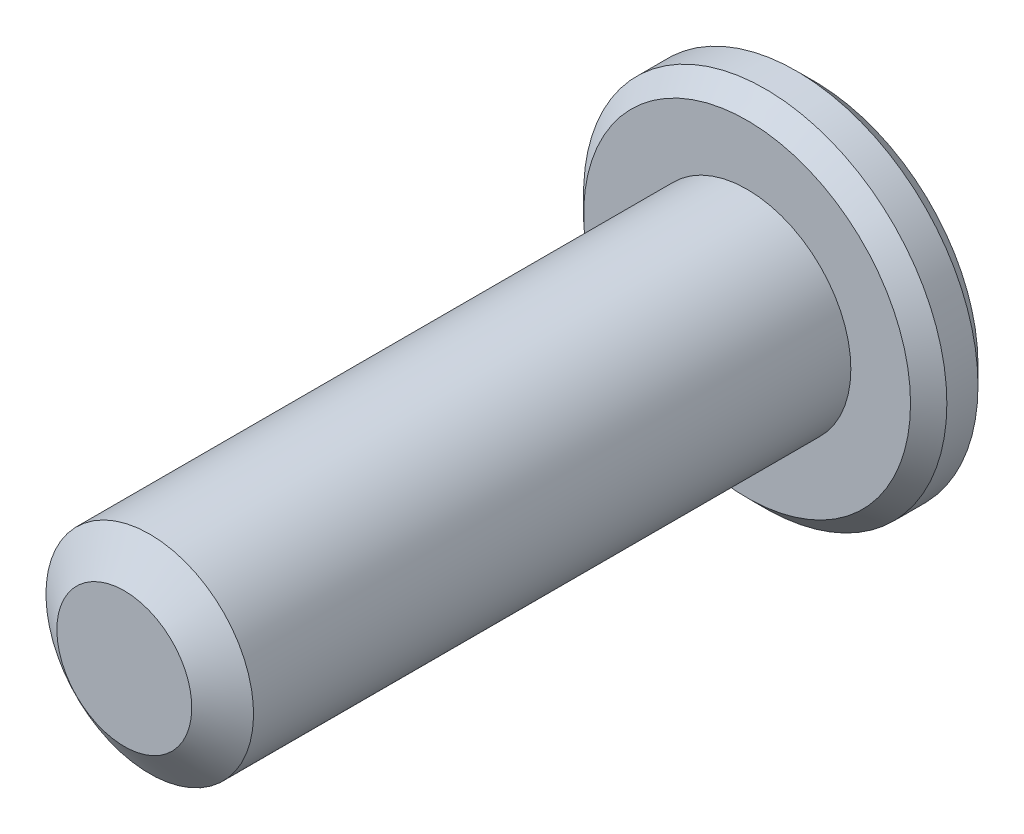
ISO-10303-21;
HEADER;
FILE_DESCRIPTION(('STEP AP214'),'2;1');
FILE_NAME('part.step','',(''),(''),'','','');
FILE_SCHEMA(('AUTOMOTIVE_DESIGN { 1 0 10303 214 1 1 1 1 }'));
ENDSEC;
DATA;
#1=APPLICATION_CONTEXT('core data for automotive mechanical design processes');
#2=APPLICATION_PROTOCOL_DEFINITION('international standard','automotive_design',2000,#1);
#3=PRODUCT_CONTEXT('',#1,'mechanical');
#4=PRODUCT('Part','Part','',(#3));
#5=PRODUCT_RELATED_PRODUCT_CATEGORY('part','',(#4));
#6=PRODUCT_DEFINITION_FORMATION('','',#4);
#7=PRODUCT_DEFINITION_CONTEXT('part definition',#1,'design');
#8=PRODUCT_DEFINITION('design','',#6,#7);
#9=PRODUCT_DEFINITION_SHAPE('','',#8);
#10=(LENGTH_UNIT() NAMED_UNIT(*) SI_UNIT(.MILLI.,.METRE.));
#11=(NAMED_UNIT(*) PLANE_ANGLE_UNIT() SI_UNIT($,.RADIAN.));
#12=(NAMED_UNIT(*) SI_UNIT($,.STERADIAN.) SOLID_ANGLE_UNIT());
#13=UNCERTAINTY_MEASURE_WITH_UNIT(LENGTH_MEASURE(1.E-05),#10,'distance_accuracy_value','');
#14=(GEOMETRIC_REPRESENTATION_CONTEXT(3) GLOBAL_UNCERTAINTY_ASSIGNED_CONTEXT((#13)) GLOBAL_UNIT_ASSIGNED_CONTEXT((#10,
#11,#12)) REPRESENTATION_CONTEXT('',''));
#15=CARTESIAN_POINT('',(0.,0.,0.));
#16=DIRECTION('',(0.,0.,1.));
#17=DIRECTION('',(1.,0.,0.));
#18=AXIS2_PLACEMENT_3D('',#15,#16,#17);
#19=CARTESIAN_POINT('',(0.,0.,0.));
#20=DIRECTION('',(0.,0.,1.));
#21=DIRECTION('',(1.,0.,0.));
#22=AXIS2_PLACEMENT_3D('',#19,#20,#21);
#23=PLANE('',#22);
#24=CARTESIAN_POINT('',(0.,0.,0.));
#25=DIRECTION('',(0.,0.,1.));
#26=DIRECTION('',(1.,0.,0.));
#27=AXIS2_PLACEMENT_3D('',#24,#25,#26);
#28=CIRCLE('',#27,3.15);
#29=CARTESIAN_POINT('',(3.15,0.,0.));
#30=VERTEX_POINT('',#29);
#31=EDGE_CURVE('E11',#30,#30,#28,.F.);
#32=ORIENTED_EDGE('',*,*,#31,.T.);
#33=EDGE_LOOP('',(#32));
#34=FACE_BOUND('',#33,.T.);
#35=CARTESIAN_POINT('',(0.,0.,0.));
#36=DIRECTION('',(0.,0.,1.));
#37=DIRECTION('',(1.,0.,0.));
#38=AXIS2_PLACEMENT_3D('',#35,#36,#37);
#39=CIRCLE('',#38,1.44337567297406);
#40=CARTESIAN_POINT('',(1.25,0.721687836487034,0.));
#41=VERTEX_POINT('',#40);
#42=CARTESIAN_POINT('',(0.,1.44337567297406,0.));
#43=VERTEX_POINT('',#42);
#44=EDGE_CURVE('E92',#41,#43,#39,.T.);
#45=ORIENTED_EDGE('',*,*,#44,.T.);
#46=CARTESIAN_POINT('',(0.,0.,0.));
#47=DIRECTION('',(0.,0.,1.));
#48=DIRECTION('',(1.,0.,0.));
#49=AXIS2_PLACEMENT_3D('',#46,#47,#48);
#50=CIRCLE('',#49,1.44337567297406);
#51=CARTESIAN_POINT('',(-1.25,0.721687836487029,0.));
#52=VERTEX_POINT('',#51);
#53=EDGE_CURVE('E103',#43,#52,#50,.T.);
#54=ORIENTED_EDGE('',*,*,#53,.T.);
#55=CARTESIAN_POINT('',(0.,0.,0.));
#56=DIRECTION('',(0.,0.,1.));
#57=DIRECTION('',(1.,0.,0.));
#58=AXIS2_PLACEMENT_3D('',#55,#56,#57);
#59=CIRCLE('',#58,1.44337567297406);
#60=CARTESIAN_POINT('',(-1.25,-0.721687836487031,0.));
#61=VERTEX_POINT('',#60);
#62=EDGE_CURVE('E121',#52,#61,#59,.T.);
#63=ORIENTED_EDGE('',*,*,#62,.T.);
#64=CARTESIAN_POINT('',(0.,0.,0.));
#65=DIRECTION('',(0.,0.,1.));
#66=DIRECTION('',(1.,0.,0.));
#67=AXIS2_PLACEMENT_3D('',#64,#65,#66);
#68=CIRCLE('',#67,1.44337567297406);
#69=CARTESIAN_POINT('',(0.,-1.44337567297406,0.));
#70=VERTEX_POINT('',#69);
#71=EDGE_CURVE('E256',#61,#70,#68,.T.);
#72=ORIENTED_EDGE('',*,*,#71,.T.);
#73=CARTESIAN_POINT('',(0.,0.,0.));
#74=DIRECTION('',(0.,0.,1.));
#75=DIRECTION('',(1.,0.,0.));
#76=AXIS2_PLACEMENT_3D('',#73,#74,#75);
#77=CIRCLE('',#76,1.44337567297406);
#78=CARTESIAN_POINT('',(1.25,-0.721687836487033,0.));
#79=VERTEX_POINT('',#78);
#80=EDGE_CURVE('E257',#70,#79,#77,.T.);
#81=ORIENTED_EDGE('',*,*,#80,.T.);
#82=CARTESIAN_POINT('',(0.,0.,0.));
#83=DIRECTION('',(0.,0.,1.));
#84=DIRECTION('',(1.,0.,0.));
#85=AXIS2_PLACEMENT_3D('',#82,#83,#84);
#86=CIRCLE('',#85,1.44337567297406);
#87=EDGE_CURVE('E106',#79,#41,#86,.T.);
#88=ORIENTED_EDGE('',*,*,#87,.T.);
#89=EDGE_LOOP('',(#45,#54,#63,#72,#81,#88));
#90=FACE_BOUND('',#89,.T.);
#91=ADVANCED_FACE('F34',(#34,#90),#23,.F.);
#92=CARTESIAN_POINT('',(1.25,0.721687836487033,0.975));
#93=DIRECTION('',(-0.5,-0.866025403784439,0.));
#94=DIRECTION('',(0.866025403784439,-0.5,0.));
#95=AXIS2_PLACEMENT_3D('',#92,#93,#94);
#96=PLANE('',#95);
#97=DIRECTION('',(0.,0.,-1.));
#98=VECTOR('',#97,1.);
#99=CARTESIAN_POINT('',(0.,1.44337567297406,0.975));
#100=LINE('',#99,#98);
#101=CARTESIAN_POINT('',(0.,1.44337567297406,0.975));
#102=VERTEX_POINT('',#101);
#103=EDGE_CURVE('E118',#102,#43,#100,.T.);
#104=ORIENTED_EDGE('',*,*,#103,.T.);
#105=CARTESIAN_POINT('',(1.2502,0.721572366433195,-0.000115483909135154));
#106=CARTESIAN_POINT('',(1.20722483292841,0.746384090710445,0.0246783319448971));
#107=CARTESIAN_POINT('',(1.16353099525405,0.771610739653665,0.0480162655813172));
#108=CARTESIAN_POINT('',(1.07443406915806,0.823050873919155,0.0907479959154641));
#109=CARTESIAN_POINT('',(1.02902250164293,0.849269254648334,0.110118007639587));
#110=CARTESIAN_POINT('',(0.937452179064738,0.902137405038636,0.143299516586524));
#111=CARTESIAN_POINT('',(0.891316759824113,0.928773701756387,0.157194440947345));
#112=CARTESIAN_POINT('',(0.798029919592406,0.982632884076013,0.178602717839362));
#113=CARTESIAN_POINT('',(0.750881350863619,1.00985412292348,0.186132058433214));
#114=CARTESIAN_POINT('',(0.669626443112746,1.05676666578643,0.192925501949298));
#115=CARTESIAN_POINT('',(0.635625123372058,1.07639733689152,0.193931440895651));
#116=CARTESIAN_POINT('',(0.567682235567521,1.11562418145499,0.192238585088682));
#117=CARTESIAN_POINT('',(0.533740682344341,1.1352203463451,0.189538972784462));
#118=CARTESIAN_POINT('',(0.466185143542499,1.1742235548576,0.180591069683623));
#119=CARTESIAN_POINT('',(0.432571492713224,1.19363040521233,0.174339474100295));
#120=CARTESIAN_POINT('',(0.365905361782186,1.23212011385119,0.158624318586096));
#121=CARTESIAN_POINT('',(0.332853128969703,1.2512028293628,0.149159379912542));
#122=CARTESIAN_POINT('',(0.248200308399734,1.30007715810653,0.121068609312414));
#123=CARTESIAN_POINT('',(0.19713350757036,1.32956058931202,0.1003298425478));
#124=CARTESIAN_POINT('',(0.0969991458867435,1.38737318998519,0.053612865328524));
#125=CARTESIAN_POINT('',(0.0479256884217289,1.41570576386268,0.0276517040532343));
#126=CARTESIAN_POINT('',(-0.000200000000001579,1.4434911430279,-0.000115483909135786));
#127=B_SPLINE_CURVE_WITH_KNOTS('',3,(#105,#106,#107,#108,#109,#110,#111,#112,#113,#114,#115,
#116,#117,#118,#119,#120,#121,#122,#123,#124,#125,#126),.UNSPECIFIED.,.F.,.F.,(4,2,2,2,2,2,2,2,
2,2,4),(0.,0.166533409618303,0.334037607289761,0.498880396489697,0.663307919240274,
0.780963963458826,0.898645970148452,1.01643764860773,1.13427993171549,1.32148652032141,
1.50809158792573),.UNSPECIFIED.);
#128=EDGE_CURVE('E89',#41,#43,#127,.T.);
#129=ORIENTED_EDGE('',*,*,#128,.F.);
#130=DIRECTION('',(0.,0.,-1.));
#131=VECTOR('',#130,1.);
#132=CARTESIAN_POINT('',(1.25,0.721687836487033,0.975));
#133=LINE('',#132,#131);
#134=CARTESIAN_POINT('',(1.25,0.721687836487033,0.975));
#135=VERTEX_POINT('',#134);
#136=EDGE_CURVE('E238',#135,#41,#133,.T.);
#137=ORIENTED_EDGE('',*,*,#136,.F.);
#138=DIRECTION('',(-0.866025403784439,0.499999999999999,0.));
#139=VECTOR('',#138,1.);
#140=CARTESIAN_POINT('',(1.25,0.721687836487033,0.975));
#141=LINE('',#140,#139);
#142=EDGE_CURVE('E113',#135,#102,#141,.T.);
#143=ORIENTED_EDGE('',*,*,#142,.T.);
#144=EDGE_LOOP('',(#104,#129,#137,#143));
#145=FACE_BOUND('',#144,.T.);
#146=ADVANCED_FACE('F124',(#145),#96,.T.);
#147=CARTESIAN_POINT('',(1.25,-0.72168783648703,0.975));
#148=DIRECTION('',(-1.,0.,0.));
#149=DIRECTION('',(0.,-1.,0.));
#150=AXIS2_PLACEMENT_3D('',#147,#148,#149);
#151=PLANE('',#150);
#152=ORIENTED_EDGE('',*,*,#136,.T.);
#153=CARTESIAN_POINT('',(1.25,-1.38992943348888,-0.425956782764809));
#154=CARTESIAN_POINT('',(1.25,-1.35585360144598,-0.400623845905462));
#155=CARTESIAN_POINT('',(1.25,-1.32158265708561,-0.375554038623504));
#156=CARTESIAN_POINT('',(1.25,-1.25257320054392,-0.326047772105517));
#157=CARTESIAN_POINT('',(1.25,-1.21783456799035,-0.301611480846757));
#158=CARTESIAN_POINT('',(1.25,-1.11229379200971,-0.229066172613867));
#159=CARTESIAN_POINT('',(1.25,-1.04068485708168,-0.182111039259463));
#160=CARTESIAN_POINT('',(1.25,-0.890834011639573,-0.090370816664351));
#161=CARTESIAN_POINT('',(1.25,-0.812441254075326,-0.0458291712301425));
#162=CARTESIAN_POINT('',(1.25,-0.651805951733887,0.0353370411272767));
#163=CARTESIAN_POINT('',(1.25,-0.569577514603351,0.071988205932038));
#164=CARTESIAN_POINT('',(1.25,-0.445666902783947,0.116811215274388));
#165=CARTESIAN_POINT('',(1.25,-0.405715906756983,0.129754356856506));
#166=CARTESIAN_POINT('',(1.25,-0.324892689132276,0.152426214590396));
#167=CARTESIAN_POINT('',(1.25,-0.284020400151318,0.162154694802131));
#168=CARTESIAN_POINT('',(1.25,-0.202258662465061,0.177742360186229));
#169=CARTESIAN_POINT('',(1.25,-0.161381483064384,0.183664926568388));
#170=CARTESIAN_POINT('',(1.25,-0.0792441307238302,0.191532978674059));
#171=CARTESIAN_POINT('',(1.25,-0.0379840154943749,0.193479054203921));
#172=CARTESIAN_POINT('',(1.25,0.043234160036465,0.193267103507984));
#173=CARTESIAN_POINT('',(1.25,0.0831926097530767,0.191235450956019));
#174=CARTESIAN_POINT('',(1.25,0.16274644611995,0.183447818944177));
#175=CARTESIAN_POINT('',(1.25,0.202341758544679,0.177691094556945));
#176=CARTESIAN_POINT('',(1.25,0.28154631912982,0.162661385825963));
#177=CARTESIAN_POINT('',(1.25,0.321144394728612,0.153330372505309));
#178=CARTESIAN_POINT('',(1.25,0.399480919290786,0.131632964761722));
#179=CARTESIAN_POINT('',(1.25,0.438219456017128,0.119266881803288));
#180=CARTESIAN_POINT('',(1.25,0.562551887219006,0.0749889167188917));
#181=CARTESIAN_POINT('',(1.25,0.646311872820088,0.0379381891982371));
#182=CARTESIAN_POINT('',(1.25,0.809873231963308,-0.0443641458390639));
#183=CARTESIAN_POINT('',(1.25,0.889658742138622,-0.089645710239019));
#184=CARTESIAN_POINT('',(1.25,1.04210036236046,-0.182982930104089));
#185=CARTESIAN_POINT('',(1.25,1.11491334005909,-0.230785501963126));
#186=CARTESIAN_POINT('',(1.25,1.22219009712169,-0.304648670049724));
#187=CARTESIAN_POINT('',(1.25,1.25748474843868,-0.329523500309345));
#188=CARTESIAN_POINT('',(1.25,1.32759376690005,-0.379921884715908));
#189=CARTESIAN_POINT('',(1.25,1.36240826213734,-0.405445260473571));
#190=CARTESIAN_POINT('',(1.25,1.3970231565127,-0.431237273698583));
#191=B_SPLINE_CURVE_WITH_KNOTS('',3,(#153,#154,#155,#156,#157,#158,#159,#160,#161,#162,#163,
#164,#165,#166,#167,#168,#169,#170,#171,#172,#173,#174,#175,#176,#177,#178,#179,#180,#181,#182,
#183,#184,#185,#186,#187,#188,#189,#190),.UNSPECIFIED.,.F.,.F.,(4,2,2,2,2,2,2,2,2,2,2,2,2,2,2,2,
2,2,4),(0.,0.127379033817002,0.254791503830238,0.51156114040546,0.781814668857772,
1.05114242314895,1.17702064742504,1.30290810848099,1.42664072359054,1.55035498493452,
1.67020252454504,1.7900740382739,1.91198034452075,2.03387414574237,2.30782771694623,
2.58279909340042,2.84397769429347,2.97351138093346,3.10300981562539),.UNSPECIFIED.);
#192=EDGE_CURVE('E96',#79,#41,#191,.T.);
#193=ORIENTED_EDGE('',*,*,#192,.F.);
#194=DIRECTION('',(0.,0.,-1.));
#195=VECTOR('',#194,1.);
#196=CARTESIAN_POINT('',(1.25,-0.72168783648703,0.975));
#197=LINE('',#196,#195);
#198=CARTESIAN_POINT('',(1.25,-0.72168783648703,0.975));
#199=VERTEX_POINT('',#198);
#200=EDGE_CURVE('E240',#199,#79,#197,.T.);
#201=ORIENTED_EDGE('',*,*,#200,.F.);
#202=DIRECTION('',(0.,1.,0.));
#203=VECTOR('',#202,1.);
#204=CARTESIAN_POINT('',(1.25,-0.72168783648703,0.975));
#205=LINE('',#204,#203);
#206=EDGE_CURVE('E49',#199,#135,#205,.T.);
#207=ORIENTED_EDGE('',*,*,#206,.T.);
#208=EDGE_LOOP('',(#152,#193,#201,#207));
#209=FACE_BOUND('',#208,.T.);
#210=ADVANCED_FACE('F185',(#209),#151,.T.);
#211=CARTESIAN_POINT('',(0.,-1.44337567297406,0.975));
#212=DIRECTION('',(-0.5,0.866025403784438,0.));
#213=DIRECTION('',(-0.866025403784438,-0.5,0.));
#214=AXIS2_PLACEMENT_3D('',#211,#212,#213);
#215=PLANE('',#214);
#216=ORIENTED_EDGE('',*,*,#200,.T.);
#217=CARTESIAN_POINT('',(-0.00019999999999945,-1.4434911430279,-0.000115483909134157));
#218=CARTESIAN_POINT('',(0.0427751670715872,-1.41867941875065,0.0246783319448981));
#219=CARTESIAN_POINT('',(0.0864690047459484,-1.39345276980743,0.0480162655813181));
#220=CARTESIAN_POINT('',(0.175565930841942,-1.34201263554194,0.090747995915465));
#221=CARTESIAN_POINT('',(0.220977498357064,-1.31579425481276,0.110118007639588));
#222=CARTESIAN_POINT('',(0.31254782093526,-1.26292610442246,0.143299516586525));
#223=CARTESIAN_POINT('',(0.358683240175886,-1.23628980770471,0.157194440947346));
#224=CARTESIAN_POINT('',(0.451970080407592,-1.18243062538508,0.178602717839363));
#225=CARTESIAN_POINT('',(0.499118649136379,-1.15520938653761,0.186132058433215));
#226=CARTESIAN_POINT('',(0.580373556887252,-1.10829684367467,0.192925501949299));
#227=CARTESIAN_POINT('',(0.61437487662794,-1.08866617256958,0.193931440895652));
#228=CARTESIAN_POINT('',(0.682317764432476,-1.04943932800611,0.192238585088683));
#229=CARTESIAN_POINT('',(0.716259317655656,-1.02984316311599,0.189538972784463));
#230=CARTESIAN_POINT('',(0.783814856457498,-0.990839954603497,0.180591069683624));
#231=CARTESIAN_POINT('',(0.817428507286774,-0.971433104248769,0.174339474100296));
#232=CARTESIAN_POINT('',(0.884094638217812,-0.932943395609904,0.158624318586098));
#233=CARTESIAN_POINT('',(0.917146871030294,-0.913860680098299,0.149159379912544));
#234=CARTESIAN_POINT('',(1.00179969160026,-0.864986351354566,0.121068609312416));
#235=CARTESIAN_POINT('',(1.05286649242964,-0.835502920149074,0.100329842547801));
#236=CARTESIAN_POINT('',(1.15300085411325,-0.777690319475906,0.0536128653285254));
#237=CARTESIAN_POINT('',(1.20207431157827,-0.749357745598415,0.0276517040532356));
#238=CARTESIAN_POINT('',(1.2502,-0.721572366433192,-0.00011548390913426));
#239=B_SPLINE_CURVE_WITH_KNOTS('',3,(#217,#218,#219,#220,#221,#222,#223,#224,#225,#226,#227,
#228,#229,#230,#231,#232,#233,#234,#235,#236,#237,#238),.UNSPECIFIED.,.F.,.F.,(4,2,2,2,2,2,2,2,
2,2,4),(0.,0.166533409618303,0.334037607289761,0.498880396489697,0.663307919240273,
0.780963963458825,0.898645970148451,1.01643764860773,1.13427993171549,1.32148652032141,
1.50809158792573),.UNSPECIFIED.);
#240=EDGE_CURVE('E294',#70,#79,#239,.T.);
#241=ORIENTED_EDGE('',*,*,#240,.F.);
#242=DIRECTION('',(0.,0.,-1.));
#243=VECTOR('',#242,1.);
#244=CARTESIAN_POINT('',(0.,-1.44337567297406,0.975));
#245=LINE('',#244,#243);
#246=CARTESIAN_POINT('',(0.,-1.44337567297406,0.975));
#247=VERTEX_POINT('',#246);
#248=EDGE_CURVE('E242',#247,#70,#245,.T.);
#249=ORIENTED_EDGE('',*,*,#248,.F.);
#250=DIRECTION('',(0.866025403784438,0.5,0.));
#251=VECTOR('',#250,1.);
#252=CARTESIAN_POINT('',(0.,-1.44337567297406,0.975));
#253=LINE('',#252,#251);
#254=EDGE_CURVE('E57',#247,#199,#253,.T.);
#255=ORIENTED_EDGE('',*,*,#254,.T.);
#256=EDGE_LOOP('',(#216,#241,#249,#255));
#257=FACE_BOUND('',#256,.T.);
#258=ADVANCED_FACE('F210',(#257),#215,.T.);
#259=CARTESIAN_POINT('',(-1.25,-0.72168783648703,0.975));
#260=DIRECTION('',(0.499999999999999,0.866025403784439,0.));
#261=DIRECTION('',(-0.866025403784439,0.5,0.));
#262=AXIS2_PLACEMENT_3D('',#259,#260,#261);
#263=PLANE('',#262);
#264=ORIENTED_EDGE('',*,*,#248,.T.);
#265=CARTESIAN_POINT('',(-1.2502,-0.721572366433193,-0.000115483909136238));
#266=CARTESIAN_POINT('',(-1.20722483292841,-0.746384090710442,0.0246783319448964));
#267=CARTESIAN_POINT('',(-1.16353099525405,-0.771610739653662,0.0480162655813167));
#268=CARTESIAN_POINT('',(-1.07443406915806,-0.823050873919153,0.0907479959154638));
#269=CARTESIAN_POINT('',(-1.02902250164294,-0.849269254648332,0.110118007639587));
#270=CARTESIAN_POINT('',(-0.93745217906474,-0.902137405038634,0.143299516586524));
#271=CARTESIAN_POINT('',(-0.891316759824114,-0.928773701756385,0.157194440947345));
#272=CARTESIAN_POINT('',(-0.798029919592407,-0.982632884076011,0.178602717839362));
#273=CARTESIAN_POINT('',(-0.75088135086362,-1.00985412292348,0.186132058433214));
#274=CARTESIAN_POINT('',(-0.669626443112747,-1.05676666578643,0.192925501949298));
#275=CARTESIAN_POINT('',(-0.635625123372058,-1.07639733689152,0.193931440895651));
#276=CARTESIAN_POINT('',(-0.567682235567522,-1.11562418145499,0.192238585088683));
#277=CARTESIAN_POINT('',(-0.533740682344342,-1.1352203463451,0.189538972784463));
#278=CARTESIAN_POINT('',(-0.4661851435425,-1.1742235548576,0.180591069683624));
#279=CARTESIAN_POINT('',(-0.432571492713225,-1.19363040521232,0.174339474100296));
#280=CARTESIAN_POINT('',(-0.365905361782187,-1.23212011385119,0.158624318586097));
#281=CARTESIAN_POINT('',(-0.332853128969704,-1.25120282936279,0.149159379912543));
#282=CARTESIAN_POINT('',(-0.248200308399735,-1.30007715810653,0.121068609312416));
#283=CARTESIAN_POINT('',(-0.197133507570361,-1.32956058931202,0.100329842547801));
#284=CARTESIAN_POINT('',(-0.0969991458867447,-1.38737318998519,0.0536128653285252));
#285=CARTESIAN_POINT('',(-0.04792568842173,-1.41570576386268,0.0276517040532354));
#286=CARTESIAN_POINT('',(0.000200000000000551,-1.4434911430279,-0.000115483909134179));
#287=B_SPLINE_CURVE_WITH_KNOTS('',3,(#265,#266,#267,#268,#269,#270,#271,#272,#273,#274,#275,
#276,#277,#278,#279,#280,#281,#282,#283,#284,#285,#286),.UNSPECIFIED.,.F.,.F.,(4,2,2,2,2,2,2,2,
2,2,4),(0.,0.166533409618304,0.334037607289763,0.498880396489699,0.663307919240276,
0.780963963458828,0.898645970148454,1.01643764860773,1.1342799317155,1.32148652032141,
1.50809158792574),.UNSPECIFIED.);
#288=EDGE_CURVE('E253',#61,#70,#287,.T.);
#289=ORIENTED_EDGE('',*,*,#288,.F.);
#290=DIRECTION('',(0.,0.,-1.));
#291=VECTOR('',#290,1.);
#292=CARTESIAN_POINT('',(-1.25,-0.72168783648703,0.975));
#293=LINE('',#292,#291);
#294=CARTESIAN_POINT('',(-1.25,-0.72168783648703,0.975));
#295=VERTEX_POINT('',#294);
#296=EDGE_CURVE('E131',#295,#61,#293,.T.);
#297=ORIENTED_EDGE('',*,*,#296,.F.);
#298=DIRECTION('',(0.866025403784439,-0.499999999999999,0.));
#299=VECTOR('',#298,1.);
#300=CARTESIAN_POINT('',(-1.25,-0.72168783648703,0.975));
#301=LINE('',#300,#299);
#302=EDGE_CURVE('E234',#295,#247,#301,.T.);
#303=ORIENTED_EDGE('',*,*,#302,.T.);
#304=EDGE_LOOP('',(#264,#289,#297,#303));
#305=FACE_BOUND('',#304,.T.);
#306=ADVANCED_FACE('F206',(#305),#263,.T.);
#307=CARTESIAN_POINT('',(-1.25,0.721687836487031,0.975));
#308=DIRECTION('',(1.,0.,0.));
#309=DIRECTION('',(0.,1.,0.));
#310=AXIS2_PLACEMENT_3D('',#307,#308,#309);
#311=PLANE('',#310);
#312=ORIENTED_EDGE('',*,*,#296,.T.);
#313=CARTESIAN_POINT('',(-1.25,-1.38992943348888,-0.425956782764809));
#314=CARTESIAN_POINT('',(-1.25,-1.35585360144598,-0.400623845905462));
#315=CARTESIAN_POINT('',(-1.25,-1.32158265708561,-0.375554038623504));
#316=CARTESIAN_POINT('',(-1.25,-1.25257320054391,-0.326047772105518));
#317=CARTESIAN_POINT('',(-1.25,-1.21783456799035,-0.301611480846757));
#318=CARTESIAN_POINT('',(-1.25,-1.11229379200971,-0.229066172613867));
#319=CARTESIAN_POINT('',(-1.25,-1.04068485708168,-0.182111039259464));
#320=CARTESIAN_POINT('',(-1.25,-0.890834011639573,-0.090370816664352));
#321=CARTESIAN_POINT('',(-1.25,-0.812441254075325,-0.0458291712301438));
#322=CARTESIAN_POINT('',(-1.25,-0.651805951733886,0.035337041127275));
#323=CARTESIAN_POINT('',(-1.25,-0.569577514603351,0.0719882059320362));
#324=CARTESIAN_POINT('',(-1.25,-0.445666902783947,0.116811215274386));
#325=CARTESIAN_POINT('',(-1.25,-0.405715906756983,0.129754356856504));
#326=CARTESIAN_POINT('',(-1.25,-0.324892689132276,0.152426214590394));
#327=CARTESIAN_POINT('',(-1.25,-0.284020400151317,0.162154694802129));
#328=CARTESIAN_POINT('',(-1.25,-0.202258662465061,0.177742360186227));
#329=CARTESIAN_POINT('',(-1.25,-0.161381483064383,0.183664926568385));
#330=CARTESIAN_POINT('',(-1.25,-0.0792441307238298,0.191532978674057));
#331=CARTESIAN_POINT('',(-1.25,-0.0379840154943745,0.193479054203919));
#332=CARTESIAN_POINT('',(-1.25,0.0432341600364654,0.193267103507982));
#333=CARTESIAN_POINT('',(-1.25,0.0831926097530771,0.191235450956016));
#334=CARTESIAN_POINT('',(-1.25,0.162746446119951,0.183447818944174));
#335=CARTESIAN_POINT('',(-1.25,0.20234175854468,0.177691094556942));
#336=CARTESIAN_POINT('',(-1.25,0.28154631912982,0.162661385825961));
#337=CARTESIAN_POINT('',(-1.25,0.321144394728612,0.153330372505306));
#338=CARTESIAN_POINT('',(-1.25,0.399480919290787,0.131632964761719));
#339=CARTESIAN_POINT('',(-1.25,0.438219456017129,0.119266881803285));
#340=CARTESIAN_POINT('',(-1.25,0.562551887219006,0.074988916718889));
#341=CARTESIAN_POINT('',(-1.25,0.646311872820089,0.037938189198234));
#342=CARTESIAN_POINT('',(-1.25,0.809873231963309,-0.0443641458390674));
#343=CARTESIAN_POINT('',(-1.25,0.889658742138624,-0.0896457102390228));
#344=CARTESIAN_POINT('',(-1.25,1.04210036236046,-0.182982930104093));
#345=CARTESIAN_POINT('',(-1.25,1.11491334005909,-0.23078550196313));
#346=CARTESIAN_POINT('',(-1.25,1.2221900971217,-0.304648670049729));
#347=CARTESIAN_POINT('',(-1.25,1.25748474843869,-0.32952350030935));
#348=CARTESIAN_POINT('',(-1.25,1.32759376690005,-0.379921884715913));
#349=CARTESIAN_POINT('',(-1.25,1.36240826213735,-0.405445260473576));
#350=CARTESIAN_POINT('',(-1.25,1.39702315651271,-0.431237273698588));
#351=B_SPLINE_CURVE_WITH_KNOTS('',3,(#313,#314,#315,#316,#317,#318,#319,#320,#321,#322,#323,
#324,#325,#326,#327,#328,#329,#330,#331,#332,#333,#334,#335,#336,#337,#338,#339,#340,#341,#342,
#343,#344,#345,#346,#347,#348,#349,#350),.UNSPECIFIED.,.F.,.F.,(4,2,2,2,2,2,2,2,2,2,2,2,2,2,2,2,
2,2,4),(0.,0.127379033817001,0.254791503830238,0.51156114040546,0.781814668857771,
1.05114242314894,1.17702064742503,1.30290810848098,1.42664072359054,1.55035498493452,
1.67020252454504,1.7900740382739,1.91198034452075,2.03387414574236,2.30782771694623,
2.58279909340042,2.84397769429347,2.97351138093346,3.10300981562539),.UNSPECIFIED.);
#352=EDGE_CURVE('E248',#52,#61,#351,.F.);
#353=ORIENTED_EDGE('',*,*,#352,.F.);
#354=DIRECTION('',(0.,0.,-1.));
#355=VECTOR('',#354,1.);
#356=CARTESIAN_POINT('',(-1.25,0.721687836487031,0.975));
#357=LINE('',#356,#355);
#358=CARTESIAN_POINT('',(-1.25,0.721687836487031,0.975));
#359=VERTEX_POINT('',#358);
#360=EDGE_CURVE('E120',#359,#52,#357,.T.);
#361=ORIENTED_EDGE('',*,*,#360,.F.);
#362=DIRECTION('',(0.,-1.,0.));
#363=VECTOR('',#362,1.);
#364=CARTESIAN_POINT('',(-1.25,0.721687836487031,0.975));
#365=LINE('',#364,#363);
#366=EDGE_CURVE('E232',#359,#295,#365,.T.);
#367=ORIENTED_EDGE('',*,*,#366,.T.);
#368=EDGE_LOOP('',(#312,#353,#361,#367));
#369=FACE_BOUND('',#368,.T.);
#370=ADVANCED_FACE('F203',(#369),#311,.T.);
#371=CARTESIAN_POINT('',(0.,1.44337567297406,0.975));
#372=DIRECTION('',(0.5,-0.866025403784438,0.));
#373=DIRECTION('',(0.866025403784438,0.5,0.));
#374=AXIS2_PLACEMENT_3D('',#371,#372,#373);
#375=PLANE('',#374);
#376=ORIENTED_EDGE('',*,*,#360,.T.);
#377=CARTESIAN_POINT('',(0.000199999999998251,1.4434911430279,-0.000115483909135892));
#378=CARTESIAN_POINT('',(-0.0427751670715882,1.41867941875065,0.0246783319448963));
#379=CARTESIAN_POINT('',(-0.0864690047459495,1.39345276980743,0.0480162655813164));
#380=CARTESIAN_POINT('',(-0.175565930841943,1.34201263554194,0.0907479959154631));
#381=CARTESIAN_POINT('',(-0.220977498357065,1.31579425481276,0.110118007639586));
#382=CARTESIAN_POINT('',(-0.312547820935261,1.26292610442246,0.143299516586523));
#383=CARTESIAN_POINT('',(-0.358683240175886,1.23628980770471,0.157194440947344));
#384=CARTESIAN_POINT('',(-0.451970080407593,1.18243062538508,0.178602717839361));
#385=CARTESIAN_POINT('',(-0.49911864913638,1.15520938653761,0.186132058433213));
#386=CARTESIAN_POINT('',(-0.580373556887253,1.10829684367467,0.192925501949297));
#387=CARTESIAN_POINT('',(-0.614374876627941,1.08866617256958,0.19393144089565));
#388=CARTESIAN_POINT('',(-0.682317764432478,1.04943932800611,0.192238585088681));
#389=CARTESIAN_POINT('',(-0.716259317655658,1.02984316311599,0.189538972784461));
#390=CARTESIAN_POINT('',(-0.7838148564575,0.990839954603499,0.180591069683622));
#391=CARTESIAN_POINT('',(-0.817428507286775,0.971433104248771,0.174339474100294));
#392=CARTESIAN_POINT('',(-0.884094638217813,0.932943395609905,0.158624318586096));
#393=CARTESIAN_POINT('',(-0.917146871030295,0.9138606800983,0.149159379912541));
#394=CARTESIAN_POINT('',(-1.00179969160026,0.864986351354568,0.121068609312414));
#395=CARTESIAN_POINT('',(-1.05286649242964,0.835502920149076,0.100329842547799));
#396=CARTESIAN_POINT('',(-1.15300085411326,0.777690319475908,0.0536128653285229));
#397=CARTESIAN_POINT('',(-1.20207431157827,0.749357745598416,0.0276517040532329));
#398=CARTESIAN_POINT('',(-1.2502,0.721572366433193,-0.000115483909136993));
#399=B_SPLINE_CURVE_WITH_KNOTS('',3,(#377,#378,#379,#380,#381,#382,#383,#384,#385,#386,#387,
#388,#389,#390,#391,#392,#393,#394,#395,#396,#397,#398),.UNSPECIFIED.,.F.,.F.,(4,2,2,2,2,2,2,2,
2,2,4),(0.,0.166533409618303,0.334037607289761,0.498880396489697,0.663307919240272,
0.780963963458825,0.898645970148451,1.01643764860773,1.13427993171549,1.32148652032141,
1.50809158792573),.UNSPECIFIED.);
#400=EDGE_CURVE('E112',#43,#52,#399,.T.);
#401=ORIENTED_EDGE('',*,*,#400,.F.);
#402=ORIENTED_EDGE('',*,*,#103,.F.);
#403=DIRECTION('',(-0.866025403784438,-0.5,0.));
#404=VECTOR('',#403,1.);
#405=CARTESIAN_POINT('',(0.,1.44337567297406,0.975));
#406=LINE('',#405,#404);
#407=EDGE_CURVE('E230',#102,#359,#406,.T.);
#408=ORIENTED_EDGE('',*,*,#407,.T.);
#409=EDGE_LOOP('',(#376,#401,#402,#408));
#410=FACE_BOUND('',#409,.T.);
#411=ADVANCED_FACE('F117',(#410),#375,.T.);
#412=CARTESIAN_POINT('',(0.,0.,13.3));
#413=DIRECTION('',(0.,0.,-1.));
#414=DIRECTION('',(-1.,0.,0.));
#415=AXIS2_PLACEMENT_3D('',#412,#413,#414);
#416=CYLINDRICAL_SURFACE('',#415,2.);
#417=CARTESIAN_POINT('',(0.,0.,1.3));
#418=DIRECTION('',(0.,0.,1.));
#419=DIRECTION('',(1.,0.,0.));
#420=AXIS2_PLACEMENT_3D('',#417,#418,#419);
#421=CIRCLE('',#420,2.);
#422=CARTESIAN_POINT('',(2.,0.,1.3));
#423=VERTEX_POINT('',#422);
#424=EDGE_CURVE('E126',#423,#423,#421,.T.);
#425=ORIENTED_EDGE('',*,*,#424,.T.);
#426=EDGE_LOOP('',(#425));
#427=FACE_BOUND('',#426,.T.);
#428=CARTESIAN_POINT('',(0.,0.,12.8098547232532));
#429=DIRECTION('',(0.,0.,-1.));
#430=DIRECTION('',(0.,1.,0.));
#431=AXIS2_PLACEMENT_3D('',#428,#429,#430);
#432=CIRCLE('',#431,2.);
#433=CARTESIAN_POINT('',(0.,2.,12.8098547232532));
#434=VERTEX_POINT('',#433);
#435=EDGE_CURVE('E137',#434,#434,#432,.T.);
#436=ORIENTED_EDGE('',*,*,#435,.T.);
#437=EDGE_LOOP('',(#436));
#438=FACE_BOUND('',#437,.T.);
#439=ADVANCED_FACE('F163',(#427,#438),#416,.T.);
#440=CARTESIAN_POINT('',(0.,0.,13.3));
#441=DIRECTION('',(0.,0.,-1.));
#442=DIRECTION('',(0.,1.,0.));
#443=AXIS2_PLACEMENT_3D('',#440,#441,#442);
#444=CONICAL_SURFACE('',#443,1.3,0.959931088596885);
#445=ORIENTED_EDGE('',*,*,#435,.F.);
#446=EDGE_LOOP('',(#445));
#447=FACE_BOUND('',#446,.T.);
#448=CARTESIAN_POINT('',(0.,0.,13.3));
#449=DIRECTION('',(0.,0.,-1.));
#450=DIRECTION('',(0.,1.,0.));
#451=AXIS2_PLACEMENT_3D('',#448,#449,#450);
#452=CIRCLE('',#451,1.3);
#453=CARTESIAN_POINT('',(0.,1.3,13.3));
#454=VERTEX_POINT('',#453);
#455=EDGE_CURVE('E129',#454,#454,#452,.T.);
#456=ORIENTED_EDGE('',*,*,#455,.T.);
#457=EDGE_LOOP('',(#456));
#458=FACE_BOUND('',#457,.T.);
#459=ADVANCED_FACE('F166',(#447,#458),#444,.T.);
#460=CARTESIAN_POINT('',(0.,0.,13.3));
#461=DIRECTION('',(0.,0.,1.));
#462=DIRECTION('',(1.,0.,0.));
#463=AXIS2_PLACEMENT_3D('',#460,#461,#462);
#464=PLANE('',#463);
#465=ORIENTED_EDGE('',*,*,#455,.F.);
#466=EDGE_LOOP('',(#465));
#467=FACE_BOUND('',#466,.T.);
#468=ADVANCED_FACE('F159',(#467),#464,.T.);
#469=CARTESIAN_POINT('',(0.,0.,1.3));
#470=DIRECTION('',(0.,0.,1.));
#471=DIRECTION('',(1.,0.,0.));
#472=AXIS2_PLACEMENT_3D('',#469,#470,#471);
#473=PLANE('',#472);
#474=CARTESIAN_POINT('',(0.,0.,1.3));
#475=DIRECTION('',(0.,0.,1.));
#476=DIRECTION('',(1.,0.,0.));
#477=AXIS2_PLACEMENT_3D('',#474,#475,#476);
#478=CIRCLE('',#477,3.15);
#479=CARTESIAN_POINT('',(3.15,0.,1.3));
#480=VERTEX_POINT('',#479);
#481=EDGE_CURVE('E139',#480,#480,#478,.T.);
#482=ORIENTED_EDGE('',*,*,#481,.T.);
#483=EDGE_LOOP('',(#482));
#484=FACE_BOUND('',#483,.T.);
#485=ORIENTED_EDGE('',*,*,#424,.F.);
#486=EDGE_LOOP('',(#485));
#487=FACE_BOUND('',#486,.T.);
#488=ADVANCED_FACE('F156',(#484,#487),#473,.T.);
#489=CARTESIAN_POINT('',(0.,0.,1.3));
#490=DIRECTION('',(0.,0.,-1.));
#491=DIRECTION('',(-1.,0.,0.));
#492=AXIS2_PLACEMENT_3D('',#489,#490,#491);
#493=CYLINDRICAL_SURFACE('',#492,3.5);
#494=CARTESIAN_POINT('',(0.,0.,0.949999999999999));
#495=DIRECTION('',(0.,0.,1.));
#496=DIRECTION('',(1.,0.,0.));
#497=AXIS2_PLACEMENT_3D('',#494,#495,#496);
#498=CIRCLE('',#497,3.5);
#499=CARTESIAN_POINT('',(3.5,0.,0.949999999999999));
#500=VERTEX_POINT('',#499);
#501=EDGE_CURVE('E42',#500,#500,#498,.F.);
#502=ORIENTED_EDGE('',*,*,#501,.T.);
#503=EDGE_LOOP('',(#502));
#504=FACE_BOUND('',#503,.T.);
#505=CARTESIAN_POINT('',(0.,0.,0.35));
#506=DIRECTION('',(0.,0.,1.));
#507=DIRECTION('',(1.,0.,0.));
#508=AXIS2_PLACEMENT_3D('',#505,#506,#507);
#509=CIRCLE('',#508,3.5);
#510=CARTESIAN_POINT('',(3.5,0.,0.35));
#511=VERTEX_POINT('',#510);
#512=EDGE_CURVE('E143',#511,#511,#509,.T.);
#513=ORIENTED_EDGE('',*,*,#512,.T.);
#514=EDGE_LOOP('',(#513));
#515=FACE_BOUND('',#514,.T.);
#516=ADVANCED_FACE('F148',(#504,#515),#493,.T.);
#517=CARTESIAN_POINT('',(1.25,0.721687836487033,0.975));
#518=DIRECTION('',(0.,0.,-1.));
#519=DIRECTION('',(-1.,0.,0.));
#520=AXIS2_PLACEMENT_3D('',#517,#518,#519);
#521=PLANE('',#520);
#522=ORIENTED_EDGE('',*,*,#142,.F.);
#523=ORIENTED_EDGE('',*,*,#206,.F.);
#524=ORIENTED_EDGE('',*,*,#254,.F.);
#525=ORIENTED_EDGE('',*,*,#302,.F.);
#526=ORIENTED_EDGE('',*,*,#366,.F.);
#527=ORIENTED_EDGE('',*,*,#407,.F.);
#528=EDGE_LOOP('',(#522,#523,#524,#525,#526,#527));
#529=FACE_BOUND('',#528,.T.);
#530=ADVANCED_FACE('F193',(#529),#521,.T.);
#531=CARTESIAN_POINT('',(0.,0.,0.));
#532=DIRECTION('',(0.,0.,-1.));
#533=DIRECTION('',(1.,0.,0.));
#534=AXIS2_PLACEMENT_3D('',#531,#532,#533);
#535=CONICAL_SURFACE('',#534,1.44337567297406,0.78539816339745);
#536=ORIENTED_EDGE('',*,*,#400,.T.);
#537=ORIENTED_EDGE('',*,*,#53,.F.);
#538=EDGE_LOOP('',(#536,#537));
#539=FACE_BOUND('',#538,.T.);
#540=ADVANCED_FACE('F111',(#539),#535,.F.);
#541=CARTESIAN_POINT('',(0.,0.,0.));
#542=DIRECTION('',(0.,0.,-1.));
#543=DIRECTION('',(1.,0.,0.));
#544=AXIS2_PLACEMENT_3D('',#541,#542,#543);
#545=CONICAL_SURFACE('',#544,1.44337567297406,0.78539816339745);
#546=ORIENTED_EDGE('',*,*,#352,.T.);
#547=ORIENTED_EDGE('',*,*,#62,.F.);
#548=EDGE_LOOP('',(#546,#547));
#549=FACE_BOUND('',#548,.T.);
#550=ADVANCED_FACE('F219',(#549),#545,.F.);
#551=CARTESIAN_POINT('',(0.,0.,0.));
#552=DIRECTION('',(0.,0.,-1.));
#553=DIRECTION('',(1.,0.,0.));
#554=AXIS2_PLACEMENT_3D('',#551,#552,#553);
#555=CONICAL_SURFACE('',#554,1.44337567297406,0.78539816339745);
#556=ORIENTED_EDGE('',*,*,#288,.T.);
#557=ORIENTED_EDGE('',*,*,#71,.F.);
#558=EDGE_LOOP('',(#556,#557));
#559=FACE_BOUND('',#558,.T.);
#560=ADVANCED_FACE('F276',(#559),#555,.F.);
#561=CARTESIAN_POINT('',(0.,0.,0.));
#562=DIRECTION('',(0.,0.,-1.));
#563=DIRECTION('',(1.,0.,0.));
#564=AXIS2_PLACEMENT_3D('',#561,#562,#563);
#565=CONICAL_SURFACE('',#564,1.44337567297406,0.78539816339745);
#566=ORIENTED_EDGE('',*,*,#240,.T.);
#567=ORIENTED_EDGE('',*,*,#80,.F.);
#568=EDGE_LOOP('',(#566,#567));
#569=FACE_BOUND('',#568,.T.);
#570=ADVANCED_FACE('F280',(#569),#565,.F.);
#571=CARTESIAN_POINT('',(0.,0.,0.));
#572=DIRECTION('',(0.,0.,-1.));
#573=DIRECTION('',(1.,0.,0.));
#574=AXIS2_PLACEMENT_3D('',#571,#572,#573);
#575=CONICAL_SURFACE('',#574,1.44337567297406,0.78539816339745);
#576=ORIENTED_EDGE('',*,*,#192,.T.);
#577=ORIENTED_EDGE('',*,*,#87,.F.);
#578=EDGE_LOOP('',(#576,#577));
#579=FACE_BOUND('',#578,.T.);
#580=ADVANCED_FACE('F284',(#579),#575,.F.);
#581=CARTESIAN_POINT('',(0.,0.,0.));
#582=DIRECTION('',(0.,0.,-1.));
#583=DIRECTION('',(1.,0.,0.));
#584=AXIS2_PLACEMENT_3D('',#581,#582,#583);
#585=CONICAL_SURFACE('',#584,1.44337567297406,0.78539816339745);
#586=ORIENTED_EDGE('',*,*,#128,.T.);
#587=ORIENTED_EDGE('',*,*,#44,.F.);
#588=EDGE_LOOP('',(#586,#587));
#589=FACE_BOUND('',#588,.T.);
#590=ADVANCED_FACE('F91',(#589),#585,.F.);
#591=CARTESIAN_POINT('',(0.,0.,1.3));
#592=DIRECTION('',(0.,0.,-1.));
#593=DIRECTION('',(-1.,0.,0.));
#594=AXIS2_PLACEMENT_3D('',#591,#592,#593);
#595=CONICAL_SURFACE('',#594,3.15,0.785398163397444);
#596=ORIENTED_EDGE('',*,*,#501,.F.);
#597=EDGE_LOOP('',(#596));
#598=FACE_BOUND('',#597,.T.);
#599=ORIENTED_EDGE('',*,*,#481,.F.);
#600=EDGE_LOOP('',(#599));
#601=FACE_BOUND('',#600,.T.);
#602=ADVANCED_FACE('F151',(#598,#601),#595,.T.);
#603=CARTESIAN_POINT('',(0.,0.,0.35));
#604=DIRECTION('',(0.,0.,1.));
#605=DIRECTION('',(1.,0.,0.));
#606=AXIS2_PLACEMENT_3D('',#603,#604,#605);
#607=CONICAL_SURFACE('',#606,3.5,0.785398163397449);
#608=ORIENTED_EDGE('',*,*,#31,.F.);
#609=EDGE_LOOP('',(#608));
#610=FACE_BOUND('',#609,.T.);
#611=ORIENTED_EDGE('',*,*,#512,.F.);
#612=EDGE_LOOP('',(#611));
#613=FACE_BOUND('',#612,.T.);
#614=ADVANCED_FACE('F36',(#610,#613),#607,.T.);
#615=CLOSED_SHELL('',(#91,#146,#210,#258,#306,#370,#411,#439,#459,#468,#488,#516,#530,#540,#550,
#560,#570,#580,#590,#602,#614));
#616=MANIFOLD_SOLID_BREP('B2',#615);
#617=ADVANCED_BREP_SHAPE_REPRESENTATION('',(#18,#616),#14);
#618=SHAPE_DEFINITION_REPRESENTATION(#9,#617);
ENDSEC;
END-ISO-10303-21;
